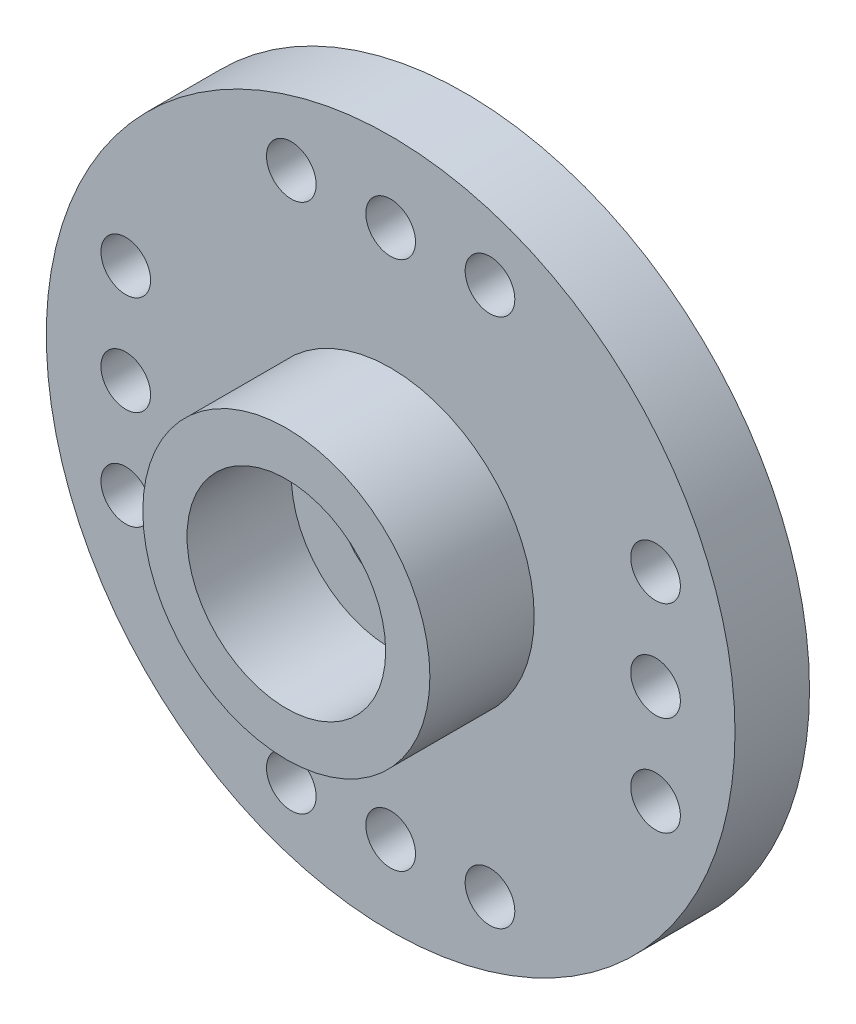
ISO-10303-21;
HEADER;
FILE_DESCRIPTION(('STEP AP214'),'2;1');
FILE_NAME('part.step','',(''),(''),'','','');
FILE_SCHEMA(('AUTOMOTIVE_DESIGN { 1 0 10303 214 1 1 1 1 }'));
ENDSEC;
DATA;
#1=APPLICATION_CONTEXT('core data for automotive mechanical design processes');
#2=APPLICATION_PROTOCOL_DEFINITION('international standard','automotive_design',2000,#1);
#3=PRODUCT_CONTEXT('',#1,'mechanical');
#4=PRODUCT('Part','Part','',(#3));
#5=PRODUCT_RELATED_PRODUCT_CATEGORY('part','',(#4));
#6=PRODUCT_DEFINITION_FORMATION('','',#4);
#7=PRODUCT_DEFINITION_CONTEXT('part definition',#1,'design');
#8=PRODUCT_DEFINITION('design','',#6,#7);
#9=PRODUCT_DEFINITION_SHAPE('','',#8);
#10=(LENGTH_UNIT() NAMED_UNIT(*) SI_UNIT(.MILLI.,.METRE.));
#11=(NAMED_UNIT(*) PLANE_ANGLE_UNIT() SI_UNIT($,.RADIAN.));
#12=(NAMED_UNIT(*) SI_UNIT($,.STERADIAN.) SOLID_ANGLE_UNIT());
#13=UNCERTAINTY_MEASURE_WITH_UNIT(LENGTH_MEASURE(1.E-05),#10,'distance_accuracy_value','');
#14=(GEOMETRIC_REPRESENTATION_CONTEXT(3) GLOBAL_UNCERTAINTY_ASSIGNED_CONTEXT((#13)) GLOBAL_UNIT_ASSIGNED_CONTEXT((#10,
#11,#12)) REPRESENTATION_CONTEXT('',''));
#15=CARTESIAN_POINT('',(0.,0.,0.));
#16=DIRECTION('',(0.,0.,1.));
#17=DIRECTION('',(1.,0.,0.));
#18=AXIS2_PLACEMENT_3D('',#15,#16,#17);
#19=CARTESIAN_POINT('',(0.,0.,2.25));
#20=DIRECTION('',(0.,0.,-1.));
#21=DIRECTION('',(-1.,0.,0.));
#22=AXIS2_PLACEMENT_3D('',#19,#20,#21);
#23=CYLINDRICAL_SURFACE('',#22,10.4);
#24=CARTESIAN_POINT('',(0.,0.,2.25));
#25=DIRECTION('',(0.,0.,1.));
#26=DIRECTION('',(1.,0.,0.));
#27=AXIS2_PLACEMENT_3D('',#24,#25,#26);
#28=CIRCLE('',#27,10.4);
#29=CARTESIAN_POINT('',(10.4,0.,2.25));
#30=VERTEX_POINT('',#29);
#31=EDGE_CURVE('E45',#30,#30,#28,.T.);
#32=ORIENTED_EDGE('',*,*,#31,.F.);
#33=EDGE_LOOP('',(#32));
#34=FACE_BOUND('',#33,.T.);
#35=CARTESIAN_POINT('',(0.,0.,0.));
#36=DIRECTION('',(0.,0.,1.));
#37=DIRECTION('',(1.,0.,0.));
#38=AXIS2_PLACEMENT_3D('',#35,#36,#37);
#39=CIRCLE('',#38,10.4);
#40=CARTESIAN_POINT('',(10.4,0.,0.));
#41=VERTEX_POINT('',#40);
#42=EDGE_CURVE('E50',#41,#41,#39,.T.);
#43=ORIENTED_EDGE('',*,*,#42,.T.);
#44=EDGE_LOOP('',(#43));
#45=FACE_BOUND('',#44,.T.);
#46=ADVANCED_FACE('F34',(#34,#45),#23,.T.);
#47=CARTESIAN_POINT('',(0.,0.,2.25));
#48=DIRECTION('',(0.,0.,1.));
#49=DIRECTION('',(1.,0.,0.));
#50=AXIS2_PLACEMENT_3D('',#47,#48,#49);
#51=PLANE('',#50);
#52=CARTESIAN_POINT('',(-7.9999999999994,-3.00000000000077,2.25));
#53=DIRECTION('',(0.,0.,1.));
#54=DIRECTION('',(1.,0.,0.));
#55=AXIS2_PLACEMENT_3D('',#52,#53,#54);
#56=CIRCLE('',#55,0.750000000000998);
#57=CARTESIAN_POINT('',(-7.24999999999841,-3.00000000000077,2.25));
#58=VERTEX_POINT('',#57);
#59=EDGE_CURVE('E239',#58,#58,#56,.T.);
#60=ORIENTED_EDGE('',*,*,#59,.F.);
#61=EDGE_LOOP('',(#60));
#62=FACE_BOUND('',#61,.T.);
#63=CARTESIAN_POINT('',(-7.99999999999941,2.99999999999923,2.25));
#64=DIRECTION('',(0.,0.,1.));
#65=DIRECTION('',(1.,0.,0.));
#66=AXIS2_PLACEMENT_3D('',#63,#64,#65);
#67=CIRCLE('',#66,0.750000000000978);
#68=CARTESIAN_POINT('',(-7.24999999999843,2.99999999999923,2.25));
#69=VERTEX_POINT('',#68);
#70=EDGE_CURVE('E240',#69,#69,#67,.T.);
#71=ORIENTED_EDGE('',*,*,#70,.F.);
#72=EDGE_LOOP('',(#71));
#73=FACE_BOUND('',#72,.T.);
#74=CARTESIAN_POINT('',(-7.9999999999994,-7.66632617932908E-13,2.25));
#75=DIRECTION('',(0.,0.,1.));
#76=DIRECTION('',(1.,0.,0.));
#77=AXIS2_PLACEMENT_3D('',#74,#75,#76);
#78=CIRCLE('',#77,0.750000000000987);
#79=CARTESIAN_POINT('',(-7.24999999999842,-7.66632617932908E-13,2.25));
#80=VERTEX_POINT('',#79);
#81=EDGE_CURVE('E217',#80,#80,#78,.T.);
#82=ORIENTED_EDGE('',*,*,#81,.F.);
#83=EDGE_LOOP('',(#82));
#84=FACE_BOUND('',#83,.T.);
#85=CARTESIAN_POINT('',(3.,8.,2.25));
#86=DIRECTION('',(0.,0.,1.));
#87=DIRECTION('',(1.,0.,0.));
#88=AXIS2_PLACEMENT_3D('',#85,#86,#87);
#89=CIRCLE('',#88,0.750000000000001);
#90=CARTESIAN_POINT('',(3.75,8.,2.25));
#91=VERTEX_POINT('',#90);
#92=EDGE_CURVE('E221',#91,#91,#89,.T.);
#93=ORIENTED_EDGE('',*,*,#92,.F.);
#94=EDGE_LOOP('',(#93));
#95=FACE_BOUND('',#94,.T.);
#96=CARTESIAN_POINT('',(-3.,8.,2.25));
#97=DIRECTION('',(0.,0.,1.));
#98=DIRECTION('',(1.,0.,0.));
#99=AXIS2_PLACEMENT_3D('',#96,#97,#98);
#100=CIRCLE('',#99,0.750000000000001);
#101=CARTESIAN_POINT('',(-2.25,8.,2.25));
#102=VERTEX_POINT('',#101);
#103=EDGE_CURVE('E230',#102,#102,#100,.T.);
#104=ORIENTED_EDGE('',*,*,#103,.F.);
#105=EDGE_LOOP('',(#104));
#106=FACE_BOUND('',#105,.T.);
#107=CARTESIAN_POINT('',(8.00000000000077,5.95649999847863E-13,2.25));
#108=DIRECTION('',(0.,0.,1.));
#109=DIRECTION('',(1.,0.,0.));
#110=AXIS2_PLACEMENT_3D('',#107,#108,#109);
#111=CIRCLE('',#110,0.750000000000373);
#112=CARTESIAN_POINT('',(8.75000000000114,5.95649999847863E-13,2.25));
#113=VERTEX_POINT('',#112);
#114=EDGE_CURVE('E228',#113,#113,#111,.T.);
#115=ORIENTED_EDGE('',*,*,#114,.F.);
#116=EDGE_LOOP('',(#115));
#117=FACE_BOUND('',#116,.T.);
#118=CARTESIAN_POINT('',(8.00000000000077,-2.9999999999994,2.25));
#119=DIRECTION('',(0.,0.,1.));
#120=DIRECTION('',(1.,0.,0.));
#121=AXIS2_PLACEMENT_3D('',#118,#119,#120);
#122=CIRCLE('',#121,0.75000000000037);
#123=CARTESIAN_POINT('',(8.75000000000114,-2.9999999999994,2.25));
#124=VERTEX_POINT('',#123);
#125=EDGE_CURVE('E225',#124,#124,#122,.T.);
#126=ORIENTED_EDGE('',*,*,#125,.F.);
#127=EDGE_LOOP('',(#126));
#128=FACE_BOUND('',#127,.T.);
#129=CARTESIAN_POINT('',(3.00000000000136,-8.00000000000017,2.25));
#130=DIRECTION('',(0.,0.,1.));
#131=DIRECTION('',(1.,0.,0.));
#132=AXIS2_PLACEMENT_3D('',#129,#130,#131);
#133=CIRCLE('',#132,0.750000000001312);
#134=CARTESIAN_POINT('',(3.75000000000267,-8.00000000000017,2.25));
#135=VERTEX_POINT('',#134);
#136=EDGE_CURVE('E215',#135,#135,#133,.T.);
#137=ORIENTED_EDGE('',*,*,#136,.F.);
#138=EDGE_LOOP('',(#137));
#139=FACE_BOUND('',#138,.T.);
#140=CARTESIAN_POINT('',(-2.99999999999864,-8.00000000000017,2.25));
#141=DIRECTION('',(0.,0.,1.));
#142=DIRECTION('',(1.,0.,0.));
#143=AXIS2_PLACEMENT_3D('',#140,#141,#142);
#144=CIRCLE('',#143,0.7500000000013);
#145=CARTESIAN_POINT('',(-2.24999999999734,-8.00000000000017,2.25));
#146=VERTEX_POINT('',#145);
#147=EDGE_CURVE('E191',#146,#146,#144,.T.);
#148=ORIENTED_EDGE('',*,*,#147,.F.);
#149=EDGE_LOOP('',(#148));
#150=FACE_BOUND('',#149,.T.);
#151=CARTESIAN_POINT('',(1.36130290034145E-12,-8.00000000000017,2.25));
#152=DIRECTION('',(0.,0.,1.));
#153=DIRECTION('',(1.,0.,0.));
#154=AXIS2_PLACEMENT_3D('',#151,#152,#153);
#155=CIRCLE('',#154,0.750000000001306);
#156=CARTESIAN_POINT('',(0.750000000002667,-8.00000000000017,2.25));
#157=VERTEX_POINT('',#156);
#158=EDGE_CURVE('E211',#157,#157,#155,.T.);
#159=ORIENTED_EDGE('',*,*,#158,.F.);
#160=EDGE_LOOP('',(#159));
#161=FACE_BOUND('',#160,.T.);
#162=CARTESIAN_POINT('',(8.00000000000076,3.0000000000006,2.25));
#163=DIRECTION('',(0.,0.,1.));
#164=DIRECTION('',(1.,0.,0.));
#165=AXIS2_PLACEMENT_3D('',#162,#163,#164);
#166=CIRCLE('',#165,0.750000000000377);
#167=CARTESIAN_POINT('',(8.75000000000114,3.0000000000006,2.25));
#168=VERTEX_POINT('',#167);
#169=EDGE_CURVE('E214',#168,#168,#166,.T.);
#170=ORIENTED_EDGE('',*,*,#169,.F.);
#171=EDGE_LOOP('',(#170));
#172=FACE_BOUND('',#171,.T.);
#173=CARTESIAN_POINT('',(0.,8.,2.25));
#174=DIRECTION('',(0.,0.,1.));
#175=DIRECTION('',(1.,0.,0.));
#176=AXIS2_PLACEMENT_3D('',#173,#174,#175);
#177=CIRCLE('',#176,0.75);
#178=CARTESIAN_POINT('',(0.75,8.,2.25));
#179=VERTEX_POINT('',#178);
#180=EDGE_CURVE('E58',#179,#179,#177,.T.);
#181=ORIENTED_EDGE('',*,*,#180,.F.);
#182=EDGE_LOOP('',(#181));
#183=FACE_BOUND('',#182,.T.);
#184=CARTESIAN_POINT('',(0.,0.,2.25));
#185=DIRECTION('',(0.,0.,1.));
#186=DIRECTION('',(1.,0.,0.));
#187=AXIS2_PLACEMENT_3D('',#184,#185,#186);
#188=CIRCLE('',#187,4.335);
#189=CARTESIAN_POINT('',(4.335,0.,2.25));
#190=VERTEX_POINT('',#189);
#191=EDGE_CURVE('E105',#190,#190,#188,.T.);
#192=ORIENTED_EDGE('',*,*,#191,.F.);
#193=EDGE_LOOP('',(#192));
#194=FACE_BOUND('',#193,.T.);
#195=ORIENTED_EDGE('',*,*,#31,.T.);
#196=EDGE_LOOP('',(#195));
#197=FACE_BOUND('',#196,.T.);
#198=ADVANCED_FACE('F112',(#62,#73,#84,#95,#106,#117,#128,#139,#150,#161,#172,#183,#194,#197),
#51,.T.);
#199=CARTESIAN_POINT('',(0.,0.,0.));
#200=DIRECTION('',(0.,0.,1.));
#201=DIRECTION('',(1.,0.,0.));
#202=AXIS2_PLACEMENT_3D('',#199,#200,#201);
#203=PLANE('',#202);
#204=CARTESIAN_POINT('',(-7.9999999999994,-3.00000000000077,0.));
#205=DIRECTION('',(0.,0.,1.));
#206=DIRECTION('',(1.,0.,0.));
#207=AXIS2_PLACEMENT_3D('',#204,#205,#206);
#208=CIRCLE('',#207,0.750000000000998);
#209=CARTESIAN_POINT('',(-7.24999999999841,-3.00000000000077,0.));
#210=VERTEX_POINT('',#209);
#211=EDGE_CURVE('E36',#210,#210,#208,.T.);
#212=ORIENTED_EDGE('',*,*,#211,.T.);
#213=EDGE_LOOP('',(#212));
#214=FACE_BOUND('',#213,.T.);
#215=CARTESIAN_POINT('',(-7.99999999999941,2.99999999999923,0.));
#216=DIRECTION('',(0.,0.,1.));
#217=DIRECTION('',(1.,0.,0.));
#218=AXIS2_PLACEMENT_3D('',#215,#216,#217);
#219=CIRCLE('',#218,0.750000000000978);
#220=CARTESIAN_POINT('',(-7.24999999999843,2.99999999999923,0.));
#221=VERTEX_POINT('',#220);
#222=EDGE_CURVE('E88',#221,#221,#219,.T.);
#223=ORIENTED_EDGE('',*,*,#222,.T.);
#224=EDGE_LOOP('',(#223));
#225=FACE_BOUND('',#224,.T.);
#226=CARTESIAN_POINT('',(-7.9999999999994,-7.66632617932908E-13,0.));
#227=DIRECTION('',(0.,0.,1.));
#228=DIRECTION('',(1.,0.,0.));
#229=AXIS2_PLACEMENT_3D('',#226,#227,#228);
#230=CIRCLE('',#229,0.750000000000987);
#231=CARTESIAN_POINT('',(-7.24999999999842,-7.66632617932908E-13,0.));
#232=VERTEX_POINT('',#231);
#233=EDGE_CURVE('E85',#232,#232,#230,.T.);
#234=ORIENTED_EDGE('',*,*,#233,.T.);
#235=EDGE_LOOP('',(#234));
#236=FACE_BOUND('',#235,.T.);
#237=CARTESIAN_POINT('',(3.,8.,0.));
#238=DIRECTION('',(0.,0.,1.));
#239=DIRECTION('',(1.,0.,0.));
#240=AXIS2_PLACEMENT_3D('',#237,#238,#239);
#241=CIRCLE('',#240,0.750000000000001);
#242=CARTESIAN_POINT('',(3.75,8.,0.));
#243=VERTEX_POINT('',#242);
#244=EDGE_CURVE('E83',#243,#243,#241,.T.);
#245=ORIENTED_EDGE('',*,*,#244,.T.);
#246=EDGE_LOOP('',(#245));
#247=FACE_BOUND('',#246,.T.);
#248=CARTESIAN_POINT('',(-3.,8.,0.));
#249=DIRECTION('',(0.,0.,1.));
#250=DIRECTION('',(1.,0.,0.));
#251=AXIS2_PLACEMENT_3D('',#248,#249,#250);
#252=CIRCLE('',#251,0.750000000000001);
#253=CARTESIAN_POINT('',(-2.25,8.,0.));
#254=VERTEX_POINT('',#253);
#255=EDGE_CURVE('E79',#254,#254,#252,.T.);
#256=ORIENTED_EDGE('',*,*,#255,.T.);
#257=EDGE_LOOP('',(#256));
#258=FACE_BOUND('',#257,.T.);
#259=CARTESIAN_POINT('',(8.00000000000077,5.95649999847863E-13,0.));
#260=DIRECTION('',(0.,0.,1.));
#261=DIRECTION('',(1.,0.,0.));
#262=AXIS2_PLACEMENT_3D('',#259,#260,#261);
#263=CIRCLE('',#262,0.750000000000373);
#264=CARTESIAN_POINT('',(8.75000000000114,5.95649999847863E-13,0.));
#265=VERTEX_POINT('',#264);
#266=EDGE_CURVE('E73',#265,#265,#263,.T.);
#267=ORIENTED_EDGE('',*,*,#266,.T.);
#268=EDGE_LOOP('',(#267));
#269=FACE_BOUND('',#268,.T.);
#270=CARTESIAN_POINT('',(8.00000000000077,-2.9999999999994,0.));
#271=DIRECTION('',(0.,0.,1.));
#272=DIRECTION('',(1.,0.,0.));
#273=AXIS2_PLACEMENT_3D('',#270,#271,#272);
#274=CIRCLE('',#273,0.75000000000037);
#275=CARTESIAN_POINT('',(8.75000000000114,-2.9999999999994,0.));
#276=VERTEX_POINT('',#275);
#277=EDGE_CURVE('E75',#276,#276,#274,.T.);
#278=ORIENTED_EDGE('',*,*,#277,.T.);
#279=EDGE_LOOP('',(#278));
#280=FACE_BOUND('',#279,.T.);
#281=CARTESIAN_POINT('',(3.00000000000136,-8.00000000000017,0.));
#282=DIRECTION('',(0.,0.,1.));
#283=DIRECTION('',(1.,0.,0.));
#284=AXIS2_PLACEMENT_3D('',#281,#282,#283);
#285=CIRCLE('',#284,0.750000000001312);
#286=CARTESIAN_POINT('',(3.75000000000267,-8.00000000000017,0.));
#287=VERTEX_POINT('',#286);
#288=EDGE_CURVE('E70',#287,#287,#285,.T.);
#289=ORIENTED_EDGE('',*,*,#288,.T.);
#290=EDGE_LOOP('',(#289));
#291=FACE_BOUND('',#290,.T.);
#292=CARTESIAN_POINT('',(-2.99999999999864,-8.00000000000017,0.));
#293=DIRECTION('',(0.,0.,1.));
#294=DIRECTION('',(1.,0.,0.));
#295=AXIS2_PLACEMENT_3D('',#292,#293,#294);
#296=CIRCLE('',#295,0.7500000000013);
#297=CARTESIAN_POINT('',(-2.24999999999734,-8.00000000000017,0.));
#298=VERTEX_POINT('',#297);
#299=EDGE_CURVE('E68',#298,#298,#296,.T.);
#300=ORIENTED_EDGE('',*,*,#299,.T.);
#301=EDGE_LOOP('',(#300));
#302=FACE_BOUND('',#301,.T.);
#303=CARTESIAN_POINT('',(1.36130290034145E-12,-8.00000000000017,0.));
#304=DIRECTION('',(0.,0.,1.));
#305=DIRECTION('',(1.,0.,0.));
#306=AXIS2_PLACEMENT_3D('',#303,#304,#305);
#307=CIRCLE('',#306,0.750000000001306);
#308=CARTESIAN_POINT('',(0.750000000002667,-8.00000000000017,0.));
#309=VERTEX_POINT('',#308);
#310=EDGE_CURVE('E64',#309,#309,#307,.T.);
#311=ORIENTED_EDGE('',*,*,#310,.T.);
#312=EDGE_LOOP('',(#311));
#313=FACE_BOUND('',#312,.T.);
#314=CARTESIAN_POINT('',(8.00000000000076,3.0000000000006,0.));
#315=DIRECTION('',(0.,0.,1.));
#316=DIRECTION('',(1.,0.,0.));
#317=AXIS2_PLACEMENT_3D('',#314,#315,#316);
#318=CIRCLE('',#317,0.750000000000377);
#319=CARTESIAN_POINT('',(8.75000000000114,3.0000000000006,0.));
#320=VERTEX_POINT('',#319);
#321=EDGE_CURVE('E56',#320,#320,#318,.T.);
#322=ORIENTED_EDGE('',*,*,#321,.T.);
#323=EDGE_LOOP('',(#322));
#324=FACE_BOUND('',#323,.T.);
#325=CARTESIAN_POINT('',(0.,8.,0.));
#326=DIRECTION('',(0.,0.,1.));
#327=DIRECTION('',(1.,0.,0.));
#328=AXIS2_PLACEMENT_3D('',#325,#326,#327);
#329=CIRCLE('',#328,0.75);
#330=CARTESIAN_POINT('',(0.75,8.,0.));
#331=VERTEX_POINT('',#330);
#332=EDGE_CURVE('E57',#331,#331,#329,.T.);
#333=ORIENTED_EDGE('',*,*,#332,.T.);
#334=EDGE_LOOP('',(#333));
#335=FACE_BOUND('',#334,.T.);
#336=CARTESIAN_POINT('',(0.,0.,0.));
#337=DIRECTION('',(0.,0.,1.));
#338=DIRECTION('',(1.,0.,0.));
#339=AXIS2_PLACEMENT_3D('',#336,#337,#338);
#340=CIRCLE('',#339,1.5);
#341=CARTESIAN_POINT('',(1.5,0.,0.));
#342=VERTEX_POINT('',#341);
#343=EDGE_CURVE('E51',#342,#342,#340,.T.);
#344=ORIENTED_EDGE('',*,*,#343,.T.);
#345=EDGE_LOOP('',(#344));
#346=FACE_BOUND('',#345,.T.);
#347=ORIENTED_EDGE('',*,*,#42,.F.);
#348=EDGE_LOOP('',(#347));
#349=FACE_BOUND('',#348,.T.);
#350=ADVANCED_FACE('F111',(#214,#225,#236,#247,#258,#269,#280,#291,#302,#313,#324,#335,#346,
#349),#203,.F.);
#351=CARTESIAN_POINT('',(0.,0.,5.4));
#352=DIRECTION('',(0.,0.,1.));
#353=DIRECTION('',(1.,0.,0.));
#354=AXIS2_PLACEMENT_3D('',#351,#352,#353);
#355=PLANE('',#354);
#356=CARTESIAN_POINT('',(0.,0.,5.4));
#357=DIRECTION('',(0.,0.,1.));
#358=DIRECTION('',(1.,0.,0.));
#359=AXIS2_PLACEMENT_3D('',#356,#357,#358);
#360=CIRCLE('',#359,4.335);
#361=CARTESIAN_POINT('',(4.335,0.,5.4));
#362=VERTEX_POINT('',#361);
#363=EDGE_CURVE('E103',#362,#362,#360,.T.);
#364=ORIENTED_EDGE('',*,*,#363,.T.);
#365=EDGE_LOOP('',(#364));
#366=FACE_BOUND('',#365,.T.);
#367=CARTESIAN_POINT('',(0.,0.,5.4));
#368=DIRECTION('',(0.,0.,1.));
#369=DIRECTION('',(1.,0.,0.));
#370=AXIS2_PLACEMENT_3D('',#367,#368,#369);
#371=CIRCLE('',#370,3.);
#372=CARTESIAN_POINT('',(3.,0.,5.4));
#373=VERTEX_POINT('',#372);
#374=EDGE_CURVE('E53',#373,#373,#371,.T.);
#375=ORIENTED_EDGE('',*,*,#374,.F.);
#376=EDGE_LOOP('',(#375));
#377=FACE_BOUND('',#376,.T.);
#378=ADVANCED_FACE('F127',(#366,#377),#355,.T.);
#379=CARTESIAN_POINT('',(0.,0.,5.4));
#380=DIRECTION('',(0.,0.,-1.));
#381=DIRECTION('',(-1.,0.,0.));
#382=AXIS2_PLACEMENT_3D('',#379,#380,#381);
#383=CYLINDRICAL_SURFACE('',#382,4.335);
#384=ORIENTED_EDGE('',*,*,#363,.F.);
#385=EDGE_LOOP('',(#384));
#386=FACE_BOUND('',#385,.T.);
#387=ORIENTED_EDGE('',*,*,#191,.T.);
#388=EDGE_LOOP('',(#387));
#389=FACE_BOUND('',#388,.T.);
#390=ADVANCED_FACE('F108',(#386,#389),#383,.T.);
#391=CARTESIAN_POINT('',(0.,0.,5.4));
#392=DIRECTION('',(0.,0.,-1.));
#393=DIRECTION('',(-1.,0.,0.));
#394=AXIS2_PLACEMENT_3D('',#391,#392,#393);
#395=CYLINDRICAL_SURFACE('',#394,3.);
#396=ORIENTED_EDGE('',*,*,#374,.T.);
#397=EDGE_LOOP('',(#396));
#398=FACE_BOUND('',#397,.T.);
#399=CARTESIAN_POINT('',(0.,0.,2.25));
#400=DIRECTION('',(0.,0.,1.));
#401=DIRECTION('',(1.,0.,0.));
#402=AXIS2_PLACEMENT_3D('',#399,#400,#401);
#403=CIRCLE('',#402,3.);
#404=CARTESIAN_POINT('',(3.,0.,2.25));
#405=VERTEX_POINT('',#404);
#406=EDGE_CURVE('E10',#405,#405,#403,.F.);
#407=ORIENTED_EDGE('',*,*,#406,.T.);
#408=EDGE_LOOP('',(#407));
#409=FACE_BOUND('',#408,.T.);
#410=ADVANCED_FACE('F133',(#398,#409),#395,.F.);
#411=CARTESIAN_POINT('',(0.,0.,2.25));
#412=DIRECTION('',(0.,0.,1.));
#413=DIRECTION('',(1.,0.,0.));
#414=AXIS2_PLACEMENT_3D('',#411,#412,#413);
#415=CIRCLE('',#414,1.5);
#416=CARTESIAN_POINT('',(1.5,0.,2.25));
#417=VERTEX_POINT('',#416);
#418=EDGE_CURVE('E54',#417,#417,#415,.T.);
#419=ORIENTED_EDGE('',*,*,#418,.F.);
#420=EDGE_LOOP('',(#419));
#421=FACE_BOUND('',#420,.T.);
#422=ORIENTED_EDGE('',*,*,#406,.F.);
#423=EDGE_LOOP('',(#422));
#424=FACE_BOUND('',#423,.T.);
#425=ADVANCED_FACE('F120',(#421,#424),#51,.T.);
#426=CARTESIAN_POINT('',(0.,0.,-0.900000000000001));
#427=DIRECTION('',(0.,0.,1.));
#428=DIRECTION('',(1.,0.,0.));
#429=AXIS2_PLACEMENT_3D('',#426,#427,#428);
#430=CYLINDRICAL_SURFACE('',#429,1.5);
#431=ORIENTED_EDGE('',*,*,#418,.T.);
#432=EDGE_LOOP('',(#431));
#433=FACE_BOUND('',#432,.T.);
#434=ORIENTED_EDGE('',*,*,#343,.F.);
#435=EDGE_LOOP('',(#434));
#436=FACE_BOUND('',#435,.T.);
#437=ADVANCED_FACE('F143',(#433,#436),#430,.F.);
#438=CARTESIAN_POINT('',(0.,8.,-0.900000000000001));
#439=DIRECTION('',(0.,0.,1.));
#440=DIRECTION('',(1.,0.,0.));
#441=AXIS2_PLACEMENT_3D('',#438,#439,#440);
#442=CYLINDRICAL_SURFACE('',#441,0.75);
#443=ORIENTED_EDGE('',*,*,#180,.T.);
#444=EDGE_LOOP('',(#443));
#445=FACE_BOUND('',#444,.T.);
#446=ORIENTED_EDGE('',*,*,#332,.F.);
#447=EDGE_LOOP('',(#446));
#448=FACE_BOUND('',#447,.T.);
#449=ADVANCED_FACE('F145',(#445,#448),#442,.F.);
#450=CARTESIAN_POINT('',(8.00000000000076,3.0000000000006,-0.900000000000001));
#451=DIRECTION('',(0.,0.,1.));
#452=DIRECTION('',(1.,0.,0.));
#453=AXIS2_PLACEMENT_3D('',#450,#451,#452);
#454=CYLINDRICAL_SURFACE('',#453,0.750000000000377);
#455=ORIENTED_EDGE('',*,*,#169,.T.);
#456=EDGE_LOOP('',(#455));
#457=FACE_BOUND('',#456,.T.);
#458=ORIENTED_EDGE('',*,*,#321,.F.);
#459=EDGE_LOOP('',(#458));
#460=FACE_BOUND('',#459,.T.);
#461=ADVANCED_FACE('F148',(#457,#460),#454,.F.);
#462=CARTESIAN_POINT('',(1.36130290034145E-12,-8.00000000000017,-0.900000000000001));
#463=DIRECTION('',(0.,0.,1.));
#464=DIRECTION('',(1.,0.,0.));
#465=AXIS2_PLACEMENT_3D('',#462,#463,#464);
#466=CYLINDRICAL_SURFACE('',#465,0.750000000001306);
#467=ORIENTED_EDGE('',*,*,#158,.T.);
#468=EDGE_LOOP('',(#467));
#469=FACE_BOUND('',#468,.T.);
#470=ORIENTED_EDGE('',*,*,#310,.F.);
#471=EDGE_LOOP('',(#470));
#472=FACE_BOUND('',#471,.T.);
#473=ADVANCED_FACE('F179',(#469,#472),#466,.F.);
#474=CARTESIAN_POINT('',(-2.99999999999864,-8.00000000000017,-0.900000000000001));
#475=DIRECTION('',(0.,0.,1.));
#476=DIRECTION('',(1.,0.,0.));
#477=AXIS2_PLACEMENT_3D('',#474,#475,#476);
#478=CYLINDRICAL_SURFACE('',#477,0.7500000000013);
#479=ORIENTED_EDGE('',*,*,#147,.T.);
#480=EDGE_LOOP('',(#479));
#481=FACE_BOUND('',#480,.T.);
#482=ORIENTED_EDGE('',*,*,#299,.F.);
#483=EDGE_LOOP('',(#482));
#484=FACE_BOUND('',#483,.T.);
#485=ADVANCED_FACE('F176',(#481,#484),#478,.F.);
#486=CARTESIAN_POINT('',(3.00000000000136,-8.00000000000017,-0.900000000000001));
#487=DIRECTION('',(0.,0.,1.));
#488=DIRECTION('',(1.,0.,0.));
#489=AXIS2_PLACEMENT_3D('',#486,#487,#488);
#490=CYLINDRICAL_SURFACE('',#489,0.750000000001312);
#491=ORIENTED_EDGE('',*,*,#136,.T.);
#492=EDGE_LOOP('',(#491));
#493=FACE_BOUND('',#492,.T.);
#494=ORIENTED_EDGE('',*,*,#288,.F.);
#495=EDGE_LOOP('',(#494));
#496=FACE_BOUND('',#495,.T.);
#497=ADVANCED_FACE('F164',(#493,#496),#490,.F.);
#498=CARTESIAN_POINT('',(8.00000000000077,-2.9999999999994,-0.900000000000001));
#499=DIRECTION('',(0.,0.,1.));
#500=DIRECTION('',(1.,0.,0.));
#501=AXIS2_PLACEMENT_3D('',#498,#499,#500);
#502=CYLINDRICAL_SURFACE('',#501,0.75000000000037);
#503=ORIENTED_EDGE('',*,*,#125,.T.);
#504=EDGE_LOOP('',(#503));
#505=FACE_BOUND('',#504,.T.);
#506=ORIENTED_EDGE('',*,*,#277,.F.);
#507=EDGE_LOOP('',(#506));
#508=FACE_BOUND('',#507,.T.);
#509=ADVANCED_FACE('F161',(#505,#508),#502,.F.);
#510=CARTESIAN_POINT('',(8.00000000000077,5.95649999847863E-13,-0.900000000000001));
#511=DIRECTION('',(0.,0.,1.));
#512=DIRECTION('',(1.,0.,0.));
#513=AXIS2_PLACEMENT_3D('',#510,#511,#512);
#514=CYLINDRICAL_SURFACE('',#513,0.750000000000373);
#515=ORIENTED_EDGE('',*,*,#114,.T.);
#516=EDGE_LOOP('',(#515));
#517=FACE_BOUND('',#516,.T.);
#518=ORIENTED_EDGE('',*,*,#266,.F.);
#519=EDGE_LOOP('',(#518));
#520=FACE_BOUND('',#519,.T.);
#521=ADVANCED_FACE('F163',(#517,#520),#514,.F.);
#522=CARTESIAN_POINT('',(-3.,8.,-0.900000000000001));
#523=DIRECTION('',(0.,0.,1.));
#524=DIRECTION('',(1.,0.,0.));
#525=AXIS2_PLACEMENT_3D('',#522,#523,#524);
#526=CYLINDRICAL_SURFACE('',#525,0.750000000000001);
#527=ORIENTED_EDGE('',*,*,#103,.T.);
#528=EDGE_LOOP('',(#527));
#529=FACE_BOUND('',#528,.T.);
#530=ORIENTED_EDGE('',*,*,#255,.F.);
#531=EDGE_LOOP('',(#530));
#532=FACE_BOUND('',#531,.T.);
#533=ADVANCED_FACE('F166',(#529,#532),#526,.F.);
#534=CARTESIAN_POINT('',(3.,8.,-0.900000000000001));
#535=DIRECTION('',(0.,0.,1.));
#536=DIRECTION('',(1.,0.,0.));
#537=AXIS2_PLACEMENT_3D('',#534,#535,#536);
#538=CYLINDRICAL_SURFACE('',#537,0.750000000000001);
#539=ORIENTED_EDGE('',*,*,#92,.T.);
#540=EDGE_LOOP('',(#539));
#541=FACE_BOUND('',#540,.T.);
#542=ORIENTED_EDGE('',*,*,#244,.F.);
#543=EDGE_LOOP('',(#542));
#544=FACE_BOUND('',#543,.T.);
#545=ADVANCED_FACE('F157',(#541,#544),#538,.F.);
#546=CARTESIAN_POINT('',(-7.9999999999994,-7.66632617932908E-13,-0.900000000000001));
#547=DIRECTION('',(0.,0.,1.));
#548=DIRECTION('',(1.,0.,0.));
#549=AXIS2_PLACEMENT_3D('',#546,#547,#548);
#550=CYLINDRICAL_SURFACE('',#549,0.750000000000987);
#551=ORIENTED_EDGE('',*,*,#81,.T.);
#552=EDGE_LOOP('',(#551));
#553=FACE_BOUND('',#552,.T.);
#554=ORIENTED_EDGE('',*,*,#233,.F.);
#555=EDGE_LOOP('',(#554));
#556=FACE_BOUND('',#555,.T.);
#557=ADVANCED_FACE('F154',(#553,#556),#550,.F.);
#558=CARTESIAN_POINT('',(-7.99999999999941,2.99999999999923,-0.900000000000001));
#559=DIRECTION('',(0.,0.,1.));
#560=DIRECTION('',(1.,0.,0.));
#561=AXIS2_PLACEMENT_3D('',#558,#559,#560);
#562=CYLINDRICAL_SURFACE('',#561,0.750000000000978);
#563=ORIENTED_EDGE('',*,*,#70,.T.);
#564=EDGE_LOOP('',(#563));
#565=FACE_BOUND('',#564,.T.);
#566=ORIENTED_EDGE('',*,*,#222,.F.);
#567=EDGE_LOOP('',(#566));
#568=FACE_BOUND('',#567,.T.);
#569=ADVANCED_FACE('F151',(#565,#568),#562,.F.);
#570=CARTESIAN_POINT('',(-7.9999999999994,-3.00000000000077,-0.900000000000001));
#571=DIRECTION('',(0.,0.,1.));
#572=DIRECTION('',(1.,0.,0.));
#573=AXIS2_PLACEMENT_3D('',#570,#571,#572);
#574=CYLINDRICAL_SURFACE('',#573,0.750000000000998);
#575=ORIENTED_EDGE('',*,*,#59,.T.);
#576=EDGE_LOOP('',(#575));
#577=FACE_BOUND('',#576,.T.);
#578=ORIENTED_EDGE('',*,*,#211,.F.);
#579=EDGE_LOOP('',(#578));
#580=FACE_BOUND('',#579,.T.);
#581=ADVANCED_FACE('F146',(#577,#580),#574,.F.);
#582=CLOSED_SHELL('',(#46,#198,#350,#378,#390,#410,#425,#437,#449,#461,#473,#485,#497,#509,#521,
#533,#545,#557,#569,#581));
#583=MANIFOLD_SOLID_BREP('B2',#582);
#584=ADVANCED_BREP_SHAPE_REPRESENTATION('',(#18,#583),#14);
#585=SHAPE_DEFINITION_REPRESENTATION(#9,#584);
ENDSEC;
END-ISO-10303-21;
